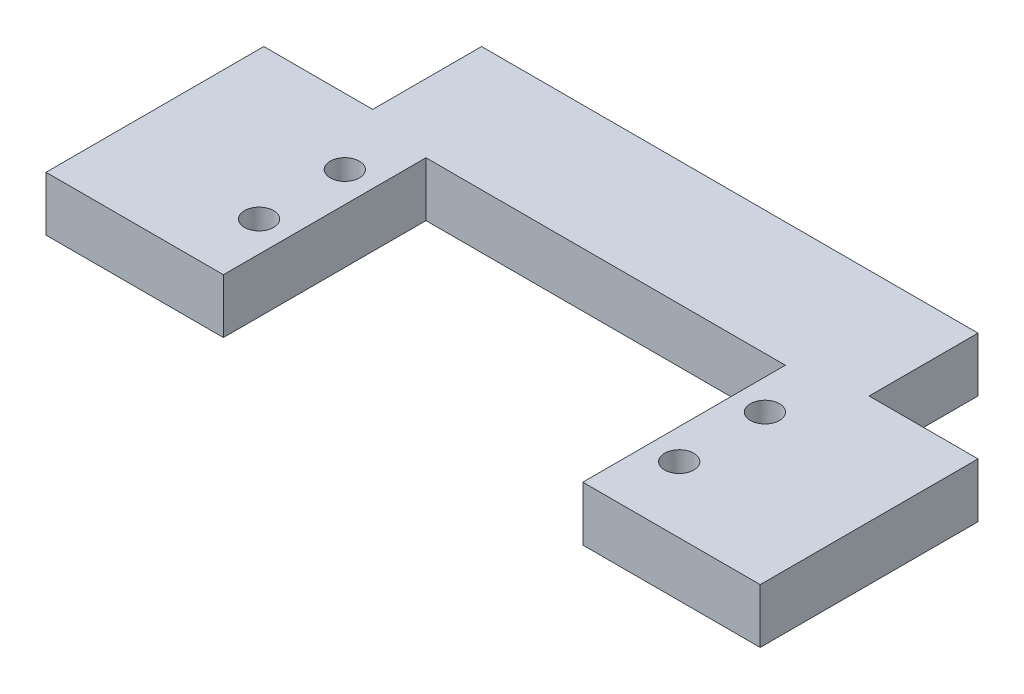
ISO-10303-21;
HEADER;
FILE_DESCRIPTION(('STEP AP214'),'2;1');
FILE_NAME('part.step','',(''),(''),'','','');
FILE_SCHEMA(('AUTOMOTIVE_DESIGN { 1 0 10303 214 1 1 1 1 }'));
ENDSEC;
DATA;
#1=APPLICATION_CONTEXT('core data for automotive mechanical design processes');
#2=APPLICATION_PROTOCOL_DEFINITION('international standard','automotive_design',2000,#1);
#3=PRODUCT_CONTEXT('',#1,'mechanical');
#4=PRODUCT('Part','Part','',(#3));
#5=PRODUCT_RELATED_PRODUCT_CATEGORY('part','',(#4));
#6=PRODUCT_DEFINITION_FORMATION('','',#4);
#7=PRODUCT_DEFINITION_CONTEXT('part definition',#1,'design');
#8=PRODUCT_DEFINITION('design','',#6,#7);
#9=PRODUCT_DEFINITION_SHAPE('','',#8);
#10=(LENGTH_UNIT() NAMED_UNIT(*) SI_UNIT(.MILLI.,.METRE.));
#11=(NAMED_UNIT(*) PLANE_ANGLE_UNIT() SI_UNIT($,.RADIAN.));
#12=(NAMED_UNIT(*) SI_UNIT($,.STERADIAN.) SOLID_ANGLE_UNIT());
#13=UNCERTAINTY_MEASURE_WITH_UNIT(LENGTH_MEASURE(1.E-05),#10,'distance_accuracy_value','');
#14=(GEOMETRIC_REPRESENTATION_CONTEXT(3) GLOBAL_UNCERTAINTY_ASSIGNED_CONTEXT((#13)) GLOBAL_UNIT_ASSIGNED_CONTEXT((#10,
#11,#12)) REPRESENTATION_CONTEXT('',''));
#15=CARTESIAN_POINT('',(0.,0.,0.));
#16=DIRECTION('',(0.,0.,1.));
#17=DIRECTION('',(1.,0.,0.));
#18=AXIS2_PLACEMENT_3D('',#15,#16,#17);
#19=CARTESIAN_POINT('',(0.,6.35,0.));
#20=DIRECTION('',(0.,1.,0.));
#21=DIRECTION('',(0.,0.,1.));
#22=AXIS2_PLACEMENT_3D('',#19,#20,#21);
#23=PLANE('',#22);
#24=DIRECTION('',(1.,0.,0.));
#25=VECTOR('',#24,1.);
#26=CARTESIAN_POINT('',(-28.94584,6.35,12.7));
#27=LINE('',#26,#25);
#28=CARTESIAN_POINT('',(-41.64584,6.35,12.7));
#29=VERTEX_POINT('',#28);
#30=CARTESIAN_POINT('',(-20.955,6.35,12.7));
#31=VERTEX_POINT('',#30);
#32=EDGE_CURVE('E171',#29,#31,#27,.T.);
#33=ORIENTED_EDGE('',*,*,#32,.T.);
#34=DIRECTION('',(0.,0.,1.));
#35=VECTOR('',#34,1.);
#36=CARTESIAN_POINT('',(-20.955,6.35,10.922));
#37=LINE('',#36,#35);
#38=CARTESIAN_POINT('',(-20.955,6.35,-10.922));
#39=VERTEX_POINT('',#38);
#40=EDGE_CURVE('E195',#39,#31,#37,.T.);
#41=ORIENTED_EDGE('',*,*,#40,.F.);
#42=DIRECTION('',(-1.,0.,0.));
#43=VECTOR('',#42,1.);
#44=CARTESIAN_POINT('',(-20.955,6.35,-10.922));
#45=LINE('',#44,#43);
#46=CARTESIAN_POINT('',(20.955,6.35,-10.922));
#47=VERTEX_POINT('',#46);
#48=EDGE_CURVE('E228',#47,#39,#45,.T.);
#49=ORIENTED_EDGE('',*,*,#48,.F.);
#50=DIRECTION('',(0.,0.,-1.));
#51=VECTOR('',#50,1.);
#52=CARTESIAN_POINT('',(20.955,6.35,10.922));
#53=LINE('',#52,#51);
#54=CARTESIAN_POINT('',(20.955,6.35,12.7));
#55=VERTEX_POINT('',#54);
#56=EDGE_CURVE('E188',#55,#47,#53,.T.);
#57=ORIENTED_EDGE('',*,*,#56,.F.);
#58=DIRECTION('',(1.,0.,0.));
#59=VECTOR('',#58,1.);
#60=CARTESIAN_POINT('',(28.94584,6.35,12.7));
#61=LINE('',#60,#59);
#62=CARTESIAN_POINT('',(41.64584,6.35,12.7));
#63=VERTEX_POINT('',#62);
#64=EDGE_CURVE('E242',#55,#63,#61,.T.);
#65=ORIENTED_EDGE('',*,*,#64,.T.);
#66=DIRECTION('',(0.,0.,-1.));
#67=VECTOR('',#66,1.);
#68=CARTESIAN_POINT('',(41.64584,6.35,-12.7));
#69=LINE('',#68,#67);
#70=CARTESIAN_POINT('',(41.64584,6.35,-12.7));
#71=VERTEX_POINT('',#70);
#72=EDGE_CURVE('E244',#63,#71,#69,.T.);
#73=ORIENTED_EDGE('',*,*,#72,.T.);
#74=DIRECTION('',(-1.,0.,0.));
#75=VECTOR('',#74,1.);
#76=CARTESIAN_POINT('',(28.94584,6.35,-12.7));
#77=LINE('',#76,#75);
#78=CARTESIAN_POINT('',(28.94584,6.35,-12.7));
#79=VERTEX_POINT('',#78);
#80=EDGE_CURVE('E117',#71,#79,#77,.T.);
#81=ORIENTED_EDGE('',*,*,#80,.T.);
#82=DIRECTION('',(0.,0.,-1.));
#83=VECTOR('',#82,1.);
#84=CARTESIAN_POINT('',(28.94584,6.35,-25.4));
#85=LINE('',#84,#83);
#86=CARTESIAN_POINT('',(28.94584,6.35,-25.4));
#87=VERTEX_POINT('',#86);
#88=EDGE_CURVE('E110',#79,#87,#85,.T.);
#89=ORIENTED_EDGE('',*,*,#88,.T.);
#90=DIRECTION('',(-1.,0.,0.));
#91=VECTOR('',#90,1.);
#92=CARTESIAN_POINT('',(6.34999999999999,6.35,-25.4));
#93=LINE('',#92,#91);
#94=CARTESIAN_POINT('',(-28.94584,6.35,-25.4));
#95=VERTEX_POINT('',#94);
#96=EDGE_CURVE('E115',#87,#95,#93,.T.);
#97=ORIENTED_EDGE('',*,*,#96,.T.);
#98=DIRECTION('',(0.,0.,1.));
#99=VECTOR('',#98,1.);
#100=CARTESIAN_POINT('',(-28.94584,6.35,-25.4));
#101=LINE('',#100,#99);
#102=CARTESIAN_POINT('',(-28.94584,6.35,-12.7));
#103=VERTEX_POINT('',#102);
#104=EDGE_CURVE('E51',#95,#103,#101,.T.);
#105=ORIENTED_EDGE('',*,*,#104,.T.);
#106=DIRECTION('',(-1.,0.,0.));
#107=VECTOR('',#106,1.);
#108=CARTESIAN_POINT('',(-28.94584,6.35,-12.7));
#109=LINE('',#108,#107);
#110=CARTESIAN_POINT('',(-41.64584,6.35,-12.7));
#111=VERTEX_POINT('',#110);
#112=EDGE_CURVE('E154',#103,#111,#109,.T.);
#113=ORIENTED_EDGE('',*,*,#112,.T.);
#114=DIRECTION('',(0.,0.,1.));
#115=VECTOR('',#114,1.);
#116=CARTESIAN_POINT('',(-41.64584,6.35,-12.7));
#117=LINE('',#116,#115);
#118=EDGE_CURVE('E94',#111,#29,#117,.T.);
#119=ORIENTED_EDGE('',*,*,#118,.T.);
#120=EDGE_LOOP('',(#33,#41,#49,#57,#65,#73,#81,#89,#97,#105,#113,#119));
#121=FACE_BOUND('',#120,.T.);
#122=CARTESIAN_POINT('',(24.49957,6.35,5.));
#123=DIRECTION('',(0.,1.,0.));
#124=DIRECTION('',(0.,0.,1.));
#125=AXIS2_PLACEMENT_3D('',#122,#123,#124);
#126=CIRCLE('',#125,1.70053);
#127=CARTESIAN_POINT('',(24.49957,6.35,6.70053));
#128=VERTEX_POINT('',#127);
#129=EDGE_CURVE('E208',#128,#128,#126,.T.);
#130=ORIENTED_EDGE('',*,*,#129,.F.);
#131=EDGE_LOOP('',(#130));
#132=FACE_BOUND('',#131,.T.);
#133=CARTESIAN_POINT('',(-24.49957,6.35,-5.));
#134=DIRECTION('',(0.,1.,0.));
#135=DIRECTION('',(0.,0.,1.));
#136=AXIS2_PLACEMENT_3D('',#133,#134,#135);
#137=CIRCLE('',#136,1.70053);
#138=CARTESIAN_POINT('',(-24.49957,6.35,-3.29947));
#139=VERTEX_POINT('',#138);
#140=EDGE_CURVE('E220',#139,#139,#137,.T.);
#141=ORIENTED_EDGE('',*,*,#140,.F.);
#142=EDGE_LOOP('',(#141));
#143=FACE_BOUND('',#142,.T.);
#144=CARTESIAN_POINT('',(-24.49957,6.35,5.));
#145=DIRECTION('',(0.,1.,0.));
#146=DIRECTION('',(0.,0.,1.));
#147=AXIS2_PLACEMENT_3D('',#144,#145,#146);
#148=CIRCLE('',#147,1.70053);
#149=CARTESIAN_POINT('',(-24.49957,6.35,6.70053));
#150=VERTEX_POINT('',#149);
#151=EDGE_CURVE('E214',#150,#150,#148,.T.);
#152=ORIENTED_EDGE('',*,*,#151,.F.);
#153=EDGE_LOOP('',(#152));
#154=FACE_BOUND('',#153,.T.);
#155=CARTESIAN_POINT('',(24.49957,6.35,-5.));
#156=DIRECTION('',(0.,1.,0.));
#157=DIRECTION('',(0.,0.,1.));
#158=AXIS2_PLACEMENT_3D('',#155,#156,#157);
#159=CIRCLE('',#158,1.70053);
#160=CARTESIAN_POINT('',(24.49957,6.35,-3.29947));
#161=VERTEX_POINT('',#160);
#162=EDGE_CURVE('E200',#161,#161,#159,.T.);
#163=ORIENTED_EDGE('',*,*,#162,.F.);
#164=EDGE_LOOP('',(#163));
#165=FACE_BOUND('',#164,.T.);
#166=ADVANCED_FACE('F34',(#121,#132,#143,#154,#165),#23,.T.);
#167=CARTESIAN_POINT('',(0.,0.,0.));
#168=DIRECTION('',(0.,1.,0.));
#169=DIRECTION('',(0.,0.,1.));
#170=AXIS2_PLACEMENT_3D('',#167,#168,#169);
#171=PLANE('',#170);
#172=CARTESIAN_POINT('',(24.49957,0.,5.));
#173=DIRECTION('',(0.,1.,0.));
#174=DIRECTION('',(0.,0.,1.));
#175=AXIS2_PLACEMENT_3D('',#172,#173,#174);
#176=CIRCLE('',#175,1.70053);
#177=CARTESIAN_POINT('',(24.49957,0.,6.70053));
#178=VERTEX_POINT('',#177);
#179=EDGE_CURVE('E206',#178,#178,#176,.T.);
#180=ORIENTED_EDGE('',*,*,#179,.T.);
#181=EDGE_LOOP('',(#180));
#182=FACE_BOUND('',#181,.T.);
#183=CARTESIAN_POINT('',(-24.49957,0.,-5.));
#184=DIRECTION('',(0.,1.,0.));
#185=DIRECTION('',(0.,0.,1.));
#186=AXIS2_PLACEMENT_3D('',#183,#184,#185);
#187=CIRCLE('',#186,1.70053);
#188=CARTESIAN_POINT('',(-24.49957,0.,-3.29947));
#189=VERTEX_POINT('',#188);
#190=EDGE_CURVE('E217',#189,#189,#187,.T.);
#191=ORIENTED_EDGE('',*,*,#190,.T.);
#192=EDGE_LOOP('',(#191));
#193=FACE_BOUND('',#192,.T.);
#194=DIRECTION('',(0.,0.,1.));
#195=VECTOR('',#194,1.);
#196=CARTESIAN_POINT('',(-20.955,0.,10.922));
#197=LINE('',#196,#195);
#198=CARTESIAN_POINT('',(-20.955,0.,-10.922));
#199=VERTEX_POINT('',#198);
#200=CARTESIAN_POINT('',(-20.955,0.,12.7));
#201=VERTEX_POINT('',#200);
#202=EDGE_CURVE('E178',#199,#201,#197,.T.);
#203=ORIENTED_EDGE('',*,*,#202,.T.);
#204=DIRECTION('',(1.,0.,0.));
#205=VECTOR('',#204,1.);
#206=CARTESIAN_POINT('',(-28.94584,0.,12.7));
#207=LINE('',#206,#205);
#208=CARTESIAN_POINT('',(-41.64584,0.,12.7));
#209=VERTEX_POINT('',#208);
#210=EDGE_CURVE('E142',#209,#201,#207,.T.);
#211=ORIENTED_EDGE('',*,*,#210,.F.);
#212=DIRECTION('',(0.,0.,1.));
#213=VECTOR('',#212,1.);
#214=CARTESIAN_POINT('',(-41.64584,0.,-12.7));
#215=LINE('',#214,#213);
#216=CARTESIAN_POINT('',(-41.64584,0.,-12.7));
#217=VERTEX_POINT('',#216);
#218=EDGE_CURVE('E139',#217,#209,#215,.T.);
#219=ORIENTED_EDGE('',*,*,#218,.F.);
#220=DIRECTION('',(-1.,0.,0.));
#221=VECTOR('',#220,1.);
#222=CARTESIAN_POINT('',(-28.94584,0.,-12.7));
#223=LINE('',#222,#221);
#224=CARTESIAN_POINT('',(-28.94584,0.,-12.7));
#225=VERTEX_POINT('',#224);
#226=EDGE_CURVE('E136',#225,#217,#223,.T.);
#227=ORIENTED_EDGE('',*,*,#226,.F.);
#228=DIRECTION('',(0.,0.,1.));
#229=VECTOR('',#228,1.);
#230=CARTESIAN_POINT('',(-28.94584,0.,-25.4));
#231=LINE('',#230,#229);
#232=CARTESIAN_POINT('',(-28.94584,0.,-25.4));
#233=VERTEX_POINT('',#232);
#234=EDGE_CURVE('E86',#233,#225,#231,.T.);
#235=ORIENTED_EDGE('',*,*,#234,.F.);
#236=DIRECTION('',(-1.,0.,0.));
#237=VECTOR('',#236,1.);
#238=CARTESIAN_POINT('',(-28.94584,0.,-25.4));
#239=LINE('',#238,#237);
#240=CARTESIAN_POINT('',(28.94584,0.,-25.4));
#241=VERTEX_POINT('',#240);
#242=EDGE_CURVE('E80',#241,#233,#239,.T.);
#243=ORIENTED_EDGE('',*,*,#242,.F.);
#244=DIRECTION('',(0.,0.,-1.));
#245=VECTOR('',#244,1.);
#246=CARTESIAN_POINT('',(28.94584,0.,-25.4));
#247=LINE('',#246,#245);
#248=CARTESIAN_POINT('',(28.94584,0.,-12.7));
#249=VERTEX_POINT('',#248);
#250=EDGE_CURVE('E126',#249,#241,#247,.T.);
#251=ORIENTED_EDGE('',*,*,#250,.F.);
#252=DIRECTION('',(-1.,0.,0.));
#253=VECTOR('',#252,1.);
#254=CARTESIAN_POINT('',(28.94584,0.,-12.7));
#255=LINE('',#254,#253);
#256=CARTESIAN_POINT('',(41.64584,0.,-12.7));
#257=VERTEX_POINT('',#256);
#258=EDGE_CURVE('E149',#257,#249,#255,.T.);
#259=ORIENTED_EDGE('',*,*,#258,.F.);
#260=DIRECTION('',(0.,0.,-1.));
#261=VECTOR('',#260,1.);
#262=CARTESIAN_POINT('',(41.64584,0.,-12.7));
#263=LINE('',#262,#261);
#264=CARTESIAN_POINT('',(41.64584,0.,12.7));
#265=VERTEX_POINT('',#264);
#266=EDGE_CURVE('E147',#265,#257,#263,.T.);
#267=ORIENTED_EDGE('',*,*,#266,.F.);
#268=DIRECTION('',(1.,0.,0.));
#269=VECTOR('',#268,1.);
#270=CARTESIAN_POINT('',(28.94584,0.,12.7));
#271=LINE('',#270,#269);
#272=CARTESIAN_POINT('',(20.955,0.,12.7));
#273=VERTEX_POINT('',#272);
#274=EDGE_CURVE('E145',#273,#265,#271,.T.);
#275=ORIENTED_EDGE('',*,*,#274,.F.);
#276=DIRECTION('',(0.,0.,-1.));
#277=VECTOR('',#276,1.);
#278=CARTESIAN_POINT('',(20.955,0.,10.922));
#279=LINE('',#278,#277);
#280=CARTESIAN_POINT('',(20.955,0.,-10.922));
#281=VERTEX_POINT('',#280);
#282=EDGE_CURVE('E223',#273,#281,#279,.T.);
#283=ORIENTED_EDGE('',*,*,#282,.T.);
#284=DIRECTION('',(-1.,0.,0.));
#285=VECTOR('',#284,1.);
#286=CARTESIAN_POINT('',(-20.955,0.,-10.922));
#287=LINE('',#286,#285);
#288=EDGE_CURVE('E182',#281,#199,#287,.T.);
#289=ORIENTED_EDGE('',*,*,#288,.T.);
#290=EDGE_LOOP('',(#203,#211,#219,#227,#235,#243,#251,#259,#267,#275,#283,#289));
#291=FACE_BOUND('',#290,.T.);
#292=CARTESIAN_POINT('',(-24.49957,0.,5.));
#293=DIRECTION('',(0.,1.,0.));
#294=DIRECTION('',(0.,0.,1.));
#295=AXIS2_PLACEMENT_3D('',#292,#293,#294);
#296=CIRCLE('',#295,1.70053);
#297=CARTESIAN_POINT('',(-24.49957,0.,6.70053));
#298=VERTEX_POINT('',#297);
#299=EDGE_CURVE('E211',#298,#298,#296,.T.);
#300=ORIENTED_EDGE('',*,*,#299,.T.);
#301=EDGE_LOOP('',(#300));
#302=FACE_BOUND('',#301,.T.);
#303=CARTESIAN_POINT('',(24.49957,0.,-5.));
#304=DIRECTION('',(0.,1.,0.));
#305=DIRECTION('',(0.,0.,1.));
#306=AXIS2_PLACEMENT_3D('',#303,#304,#305);
#307=CIRCLE('',#306,1.70053);
#308=CARTESIAN_POINT('',(24.49957,0.,-3.29947));
#309=VERTEX_POINT('',#308);
#310=EDGE_CURVE('E196',#309,#309,#307,.T.);
#311=ORIENTED_EDGE('',*,*,#310,.T.);
#312=EDGE_LOOP('',(#311));
#313=FACE_BOUND('',#312,.T.);
#314=ADVANCED_FACE('F173',(#182,#193,#291,#302,#313),#171,.F.);
#315=CARTESIAN_POINT('',(-28.94584,6.35,-12.7));
#316=DIRECTION('',(0.,0.,1.));
#317=DIRECTION('',(1.,0.,0.));
#318=AXIS2_PLACEMENT_3D('',#315,#316,#317);
#319=PLANE('',#318);
#320=ORIENTED_EDGE('',*,*,#226,.T.);
#321=DIRECTION('',(0.,-1.,0.));
#322=VECTOR('',#321,1.);
#323=CARTESIAN_POINT('',(-41.64584,6.35,-12.7));
#324=LINE('',#323,#322);
#325=EDGE_CURVE('E11',#111,#217,#324,.T.);
#326=ORIENTED_EDGE('',*,*,#325,.F.);
#327=ORIENTED_EDGE('',*,*,#112,.F.);
#328=DIRECTION('',(0.,-1.,0.));
#329=VECTOR('',#328,1.);
#330=CARTESIAN_POINT('',(-28.94584,6.35,-12.7));
#331=LINE('',#330,#329);
#332=EDGE_CURVE('E132',#103,#225,#331,.T.);
#333=ORIENTED_EDGE('',*,*,#332,.T.);
#334=EDGE_LOOP('',(#320,#326,#327,#333));
#335=FACE_BOUND('',#334,.T.);
#336=ADVANCED_FACE('F36',(#335),#319,.F.);
#337=CARTESIAN_POINT('',(-41.64584,6.35,-12.7));
#338=DIRECTION('',(1.,0.,0.));
#339=DIRECTION('',(0.,0.,-1.));
#340=AXIS2_PLACEMENT_3D('',#337,#338,#339);
#341=PLANE('',#340);
#342=ORIENTED_EDGE('',*,*,#218,.T.);
#343=DIRECTION('',(0.,-1.,0.));
#344=VECTOR('',#343,1.);
#345=CARTESIAN_POINT('',(-41.64584,6.35,12.7));
#346=LINE('',#345,#344);
#347=EDGE_CURVE('E43',#29,#209,#346,.T.);
#348=ORIENTED_EDGE('',*,*,#347,.F.);
#349=ORIENTED_EDGE('',*,*,#118,.F.);
#350=ORIENTED_EDGE('',*,*,#325,.T.);
#351=EDGE_LOOP('',(#342,#348,#349,#350));
#352=FACE_BOUND('',#351,.T.);
#353=ADVANCED_FACE('F352',(#352),#341,.F.);
#354=CARTESIAN_POINT('',(-28.94584,6.35,12.7));
#355=DIRECTION('',(0.,0.,-1.));
#356=DIRECTION('',(-1.,0.,0.));
#357=AXIS2_PLACEMENT_3D('',#354,#355,#356);
#358=PLANE('',#357);
#359=ORIENTED_EDGE('',*,*,#210,.T.);
#360=DIRECTION('',(0.,1.,0.));
#361=VECTOR('',#360,1.);
#362=CARTESIAN_POINT('',(-20.955,0.,12.7));
#363=LINE('',#362,#361);
#364=EDGE_CURVE('E191',#201,#31,#363,.T.);
#365=ORIENTED_EDGE('',*,*,#364,.T.);
#366=ORIENTED_EDGE('',*,*,#32,.F.);
#367=ORIENTED_EDGE('',*,*,#347,.T.);
#368=EDGE_LOOP('',(#359,#365,#366,#367));
#369=FACE_BOUND('',#368,.T.);
#370=ADVANCED_FACE('F167',(#369),#358,.F.);
#371=CARTESIAN_POINT('',(28.94584,6.35,12.7));
#372=DIRECTION('',(0.,0.,-1.));
#373=DIRECTION('',(-1.,0.,0.));
#374=AXIS2_PLACEMENT_3D('',#371,#372,#373);
#375=PLANE('',#374);
#376=ORIENTED_EDGE('',*,*,#274,.T.);
#377=DIRECTION('',(0.,-1.,0.));
#378=VECTOR('',#377,1.);
#379=CARTESIAN_POINT('',(41.64584,6.35,12.7));
#380=LINE('',#379,#378);
#381=EDGE_CURVE('E161',#63,#265,#380,.T.);
#382=ORIENTED_EDGE('',*,*,#381,.F.);
#383=ORIENTED_EDGE('',*,*,#64,.F.);
#384=DIRECTION('',(0.,1.,0.));
#385=VECTOR('',#384,1.);
#386=CARTESIAN_POINT('',(20.955,0.,12.7));
#387=LINE('',#386,#385);
#388=EDGE_CURVE('E197',#273,#55,#387,.T.);
#389=ORIENTED_EDGE('',*,*,#388,.F.);
#390=EDGE_LOOP('',(#376,#382,#383,#389));
#391=FACE_BOUND('',#390,.T.);
#392=ADVANCED_FACE('F337',(#391),#375,.F.);
#393=CARTESIAN_POINT('',(41.64584,6.35,-12.7));
#394=DIRECTION('',(-1.,0.,0.));
#395=DIRECTION('',(0.,0.,1.));
#396=AXIS2_PLACEMENT_3D('',#393,#394,#395);
#397=PLANE('',#396);
#398=ORIENTED_EDGE('',*,*,#266,.T.);
#399=DIRECTION('',(0.,-1.,0.));
#400=VECTOR('',#399,1.);
#401=CARTESIAN_POINT('',(41.64584,6.35,-12.7));
#402=LINE('',#401,#400);
#403=EDGE_CURVE('E158',#71,#257,#402,.T.);
#404=ORIENTED_EDGE('',*,*,#403,.F.);
#405=ORIENTED_EDGE('',*,*,#72,.F.);
#406=ORIENTED_EDGE('',*,*,#381,.T.);
#407=EDGE_LOOP('',(#398,#404,#405,#406));
#408=FACE_BOUND('',#407,.T.);
#409=ADVANCED_FACE('F251',(#408),#397,.F.);
#410=CARTESIAN_POINT('',(28.94584,6.35,-12.7));
#411=DIRECTION('',(0.,0.,1.));
#412=DIRECTION('',(1.,0.,0.));
#413=AXIS2_PLACEMENT_3D('',#410,#411,#412);
#414=PLANE('',#413);
#415=ORIENTED_EDGE('',*,*,#258,.T.);
#416=DIRECTION('',(0.,-1.,0.));
#417=VECTOR('',#416,1.);
#418=CARTESIAN_POINT('',(28.94584,6.35,-12.7));
#419=LINE('',#418,#417);
#420=EDGE_CURVE('E127',#79,#249,#419,.T.);
#421=ORIENTED_EDGE('',*,*,#420,.F.);
#422=ORIENTED_EDGE('',*,*,#80,.F.);
#423=ORIENTED_EDGE('',*,*,#403,.T.);
#424=EDGE_LOOP('',(#415,#421,#422,#423));
#425=FACE_BOUND('',#424,.T.);
#426=ADVANCED_FACE('F255',(#425),#414,.F.);
#427=CARTESIAN_POINT('',(28.94584,6.35,-25.4));
#428=DIRECTION('',(-1.,0.,0.));
#429=DIRECTION('',(0.,0.,1.));
#430=AXIS2_PLACEMENT_3D('',#427,#428,#429);
#431=PLANE('',#430);
#432=ORIENTED_EDGE('',*,*,#250,.T.);
#433=DIRECTION('',(0.,-1.,0.));
#434=VECTOR('',#433,1.);
#435=CARTESIAN_POINT('',(28.94584,6.35,-25.4));
#436=LINE('',#435,#434);
#437=EDGE_CURVE('E123',#87,#241,#436,.T.);
#438=ORIENTED_EDGE('',*,*,#437,.F.);
#439=ORIENTED_EDGE('',*,*,#88,.F.);
#440=ORIENTED_EDGE('',*,*,#420,.T.);
#441=EDGE_LOOP('',(#432,#438,#439,#440));
#442=FACE_BOUND('',#441,.T.);
#443=ADVANCED_FACE('F124',(#442),#431,.F.);
#444=CARTESIAN_POINT('',(-28.94584,6.35,-25.4));
#445=DIRECTION('',(0.,0.,1.));
#446=DIRECTION('',(1.,0.,0.));
#447=AXIS2_PLACEMENT_3D('',#444,#445,#446);
#448=PLANE('',#447);
#449=ORIENTED_EDGE('',*,*,#242,.T.);
#450=DIRECTION('',(0.,-1.,0.));
#451=VECTOR('',#450,1.);
#452=CARTESIAN_POINT('',(-28.94584,6.35,-25.4));
#453=LINE('',#452,#451);
#454=EDGE_CURVE('E128',#95,#233,#453,.T.);
#455=ORIENTED_EDGE('',*,*,#454,.F.);
#456=ORIENTED_EDGE('',*,*,#96,.F.);
#457=ORIENTED_EDGE('',*,*,#437,.T.);
#458=EDGE_LOOP('',(#449,#455,#456,#457));
#459=FACE_BOUND('',#458,.T.);
#460=ADVANCED_FACE('F130',(#459),#448,.F.);
#461=CARTESIAN_POINT('',(-28.94584,6.35,-25.4));
#462=DIRECTION('',(1.,0.,0.));
#463=DIRECTION('',(0.,0.,-1.));
#464=AXIS2_PLACEMENT_3D('',#461,#462,#463);
#465=PLANE('',#464);
#466=ORIENTED_EDGE('',*,*,#234,.T.);
#467=ORIENTED_EDGE('',*,*,#332,.F.);
#468=ORIENTED_EDGE('',*,*,#104,.F.);
#469=ORIENTED_EDGE('',*,*,#454,.T.);
#470=EDGE_LOOP('',(#466,#467,#468,#469));
#471=FACE_BOUND('',#470,.T.);
#472=ADVANCED_FACE('F259',(#471),#465,.F.);
#473=CARTESIAN_POINT('',(20.955,6.35,10.922));
#474=DIRECTION('',(-1.,0.,0.));
#475=DIRECTION('',(0.,0.,1.));
#476=AXIS2_PLACEMENT_3D('',#473,#474,#475);
#477=PLANE('',#476);
#478=ORIENTED_EDGE('',*,*,#282,.F.);
#479=ORIENTED_EDGE('',*,*,#388,.T.);
#480=ORIENTED_EDGE('',*,*,#56,.T.);
#481=DIRECTION('',(0.,-1.,0.));
#482=VECTOR('',#481,1.);
#483=CARTESIAN_POINT('',(20.955,6.35,-10.922));
#484=LINE('',#483,#482);
#485=EDGE_CURVE('E140',#47,#281,#484,.T.);
#486=ORIENTED_EDGE('',*,*,#485,.T.);
#487=EDGE_LOOP('',(#478,#479,#480,#486));
#488=FACE_BOUND('',#487,.T.);
#489=ADVANCED_FACE('F261',(#488),#477,.T.);
#490=CARTESIAN_POINT('',(-20.955,6.35,-10.922));
#491=DIRECTION('',(0.,0.,1.));
#492=DIRECTION('',(1.,0.,0.));
#493=AXIS2_PLACEMENT_3D('',#490,#491,#492);
#494=PLANE('',#493);
#495=ORIENTED_EDGE('',*,*,#288,.F.);
#496=ORIENTED_EDGE('',*,*,#485,.F.);
#497=ORIENTED_EDGE('',*,*,#48,.T.);
#498=DIRECTION('',(0.,-1.,0.));
#499=VECTOR('',#498,1.);
#500=CARTESIAN_POINT('',(-20.955,6.35,-10.922));
#501=LINE('',#500,#499);
#502=EDGE_CURVE('E232',#39,#199,#501,.T.);
#503=ORIENTED_EDGE('',*,*,#502,.T.);
#504=EDGE_LOOP('',(#495,#496,#497,#503));
#505=FACE_BOUND('',#504,.T.);
#506=ADVANCED_FACE('F267',(#505),#494,.T.);
#507=CARTESIAN_POINT('',(-20.955,6.35,10.922));
#508=DIRECTION('',(1.,0.,0.));
#509=DIRECTION('',(0.,0.,-1.));
#510=AXIS2_PLACEMENT_3D('',#507,#508,#509);
#511=PLANE('',#510);
#512=ORIENTED_EDGE('',*,*,#202,.F.);
#513=ORIENTED_EDGE('',*,*,#502,.F.);
#514=ORIENTED_EDGE('',*,*,#40,.T.);
#515=ORIENTED_EDGE('',*,*,#364,.F.);
#516=EDGE_LOOP('',(#512,#513,#514,#515));
#517=FACE_BOUND('',#516,.T.);
#518=ADVANCED_FACE('F192',(#517),#511,.T.);
#519=CARTESIAN_POINT('',(-24.49957,6.35,-5.));
#520=DIRECTION('',(0.,-1.,0.));
#521=DIRECTION('',(0.,0.,-1.));
#522=AXIS2_PLACEMENT_3D('',#519,#520,#521);
#523=CYLINDRICAL_SURFACE('',#522,1.70053);
#524=ORIENTED_EDGE('',*,*,#140,.T.);
#525=EDGE_LOOP('',(#524));
#526=FACE_BOUND('',#525,.T.);
#527=ORIENTED_EDGE('',*,*,#190,.F.);
#528=EDGE_LOOP('',(#527));
#529=FACE_BOUND('',#528,.T.);
#530=ADVANCED_FACE('F284',(#526,#529),#523,.F.);
#531=CARTESIAN_POINT('',(-24.49957,6.35,5.));
#532=DIRECTION('',(0.,-1.,0.));
#533=DIRECTION('',(0.,0.,-1.));
#534=AXIS2_PLACEMENT_3D('',#531,#532,#533);
#535=CYLINDRICAL_SURFACE('',#534,1.70053);
#536=ORIENTED_EDGE('',*,*,#151,.T.);
#537=EDGE_LOOP('',(#536));
#538=FACE_BOUND('',#537,.T.);
#539=ORIENTED_EDGE('',*,*,#299,.F.);
#540=EDGE_LOOP('',(#539));
#541=FACE_BOUND('',#540,.T.);
#542=ADVANCED_FACE('F287',(#538,#541),#535,.F.);
#543=CARTESIAN_POINT('',(24.49957,6.35,5.));
#544=DIRECTION('',(0.,-1.,0.));
#545=DIRECTION('',(0.,0.,-1.));
#546=AXIS2_PLACEMENT_3D('',#543,#544,#545);
#547=CYLINDRICAL_SURFACE('',#546,1.70053);
#548=ORIENTED_EDGE('',*,*,#129,.T.);
#549=EDGE_LOOP('',(#548));
#550=FACE_BOUND('',#549,.T.);
#551=ORIENTED_EDGE('',*,*,#179,.F.);
#552=EDGE_LOOP('',(#551));
#553=FACE_BOUND('',#552,.T.);
#554=ADVANCED_FACE('F291',(#550,#553),#547,.F.);
#555=CARTESIAN_POINT('',(24.49957,6.35,-5.));
#556=DIRECTION('',(0.,-1.,0.));
#557=DIRECTION('',(0.,0.,-1.));
#558=AXIS2_PLACEMENT_3D('',#555,#556,#557);
#559=CYLINDRICAL_SURFACE('',#558,1.70053);
#560=ORIENTED_EDGE('',*,*,#162,.T.);
#561=EDGE_LOOP('',(#560));
#562=FACE_BOUND('',#561,.T.);
#563=ORIENTED_EDGE('',*,*,#310,.F.);
#564=EDGE_LOOP('',(#563));
#565=FACE_BOUND('',#564,.T.);
#566=ADVANCED_FACE('F295',(#562,#565),#559,.F.);
#567=CLOSED_SHELL('',(#166,#314,#336,#353,#370,#392,#409,#426,#443,#460,#472,#489,#506,#518,
#530,#542,#554,#566));
#568=MANIFOLD_SOLID_BREP('B2',#567);
#569=ADVANCED_BREP_SHAPE_REPRESENTATION('',(#18,#568),#14);
#570=SHAPE_DEFINITION_REPRESENTATION(#9,#569);
ENDSEC;
END-ISO-10303-21;
